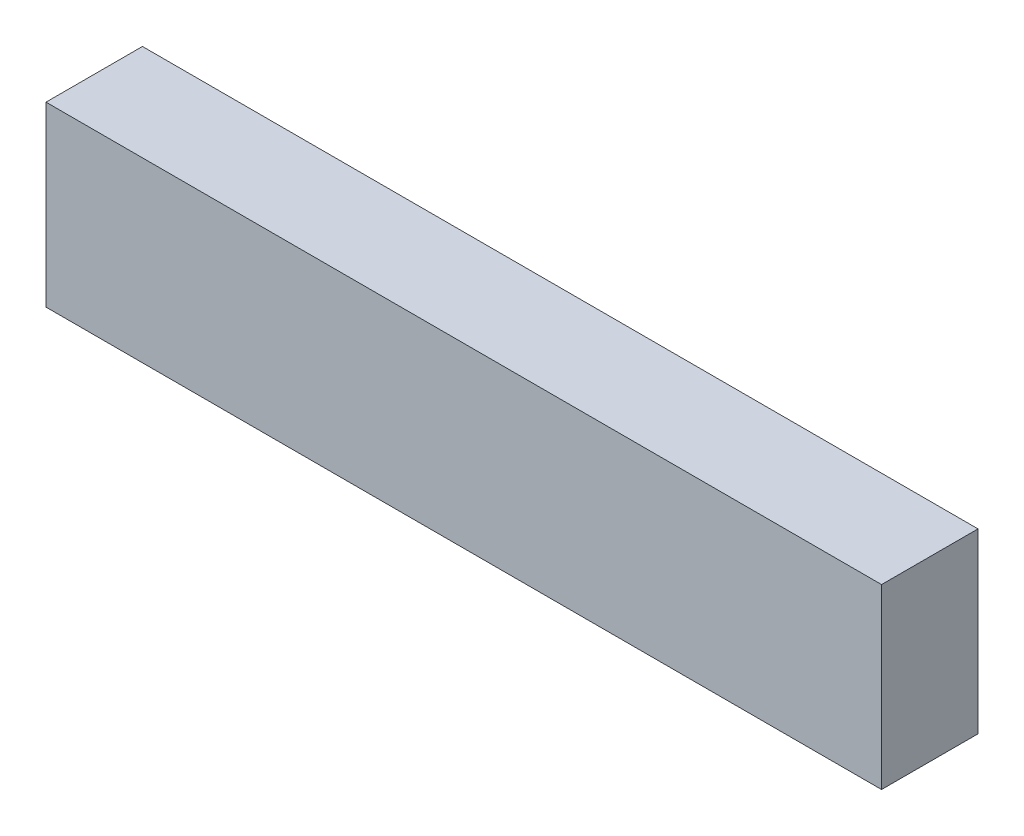
ISO-10303-21;
HEADER;
FILE_DESCRIPTION(('STEP AP214'),'2;1');
FILE_NAME('part.step','',(''),(''),'','','');
FILE_SCHEMA(('AUTOMOTIVE_DESIGN { 1 0 10303 214 1 1 1 1 }'));
ENDSEC;
DATA;
#1=APPLICATION_CONTEXT('core data for automotive mechanical design processes');
#2=APPLICATION_PROTOCOL_DEFINITION('international standard','automotive_design',2000,#1);
#3=PRODUCT_CONTEXT('',#1,'mechanical');
#4=PRODUCT('Part','Part','',(#3));
#5=PRODUCT_RELATED_PRODUCT_CATEGORY('part','',(#4));
#6=PRODUCT_DEFINITION_FORMATION('','',#4);
#7=PRODUCT_DEFINITION_CONTEXT('part definition',#1,'design');
#8=PRODUCT_DEFINITION('design','',#6,#7);
#9=PRODUCT_DEFINITION_SHAPE('','',#8);
#10=(LENGTH_UNIT() NAMED_UNIT(*) SI_UNIT(.MILLI.,.METRE.));
#11=(NAMED_UNIT(*) PLANE_ANGLE_UNIT() SI_UNIT($,.RADIAN.));
#12=(NAMED_UNIT(*) SI_UNIT($,.STERADIAN.) SOLID_ANGLE_UNIT());
#13=UNCERTAINTY_MEASURE_WITH_UNIT(LENGTH_MEASURE(1.E-05),#10,'distance_accuracy_value','');
#14=(GEOMETRIC_REPRESENTATION_CONTEXT(3) GLOBAL_UNCERTAINTY_ASSIGNED_CONTEXT((#13)) GLOBAL_UNIT_ASSIGNED_CONTEXT((#10,
#11,#12)) REPRESENTATION_CONTEXT('',''));
#15=CARTESIAN_POINT('',(0.,0.,0.));
#16=DIRECTION('',(0.,0.,1.));
#17=DIRECTION('',(1.,0.,0.));
#18=AXIS2_PLACEMENT_3D('',#15,#16,#17);
#19=CARTESIAN_POINT('',(62.6,-13.3,14.45));
#20=DIRECTION('',(-1.,0.,0.));
#21=DIRECTION('',(0.,-1.,0.));
#22=AXIS2_PLACEMENT_3D('',#19,#20,#21);
#23=PLANE('',#22);
#24=DIRECTION('',(0.,1.,0.));
#25=VECTOR('',#24,1.);
#26=CARTESIAN_POINT('',(62.6,-13.3,0.));
#27=LINE('',#26,#25);
#28=CARTESIAN_POINT('',(62.6,-13.3,0.));
#29=VERTEX_POINT('',#28);
#30=CARTESIAN_POINT('',(62.6,13.3,0.));
#31=VERTEX_POINT('',#30);
#32=EDGE_CURVE('E102',#29,#31,#27,.T.);
#33=ORIENTED_EDGE('',*,*,#32,.T.);
#34=DIRECTION('',(0.,0.,-1.));
#35=VECTOR('',#34,1.);
#36=CARTESIAN_POINT('',(62.6,13.3,14.45));
#37=LINE('',#36,#35);
#38=CARTESIAN_POINT('',(62.6,13.3,14.45));
#39=VERTEX_POINT('',#38);
#40=EDGE_CURVE('E11',#39,#31,#37,.T.);
#41=ORIENTED_EDGE('',*,*,#40,.F.);
#42=DIRECTION('',(0.,1.,0.));
#43=VECTOR('',#42,1.);
#44=CARTESIAN_POINT('',(62.6,-13.3,14.45));
#45=LINE('',#44,#43);
#46=CARTESIAN_POINT('',(62.6,-13.3,14.45));
#47=VERTEX_POINT('',#46);
#48=EDGE_CURVE('E90',#47,#39,#45,.T.);
#49=ORIENTED_EDGE('',*,*,#48,.F.);
#50=DIRECTION('',(0.,0.,-1.));
#51=VECTOR('',#50,1.);
#52=CARTESIAN_POINT('',(62.6,-13.3,14.45));
#53=LINE('',#52,#51);
#54=EDGE_CURVE('E98',#47,#29,#53,.T.);
#55=ORIENTED_EDGE('',*,*,#54,.T.);
#56=EDGE_LOOP('',(#33,#41,#49,#55));
#57=FACE_BOUND('',#56,.T.);
#58=ADVANCED_FACE('F39',(#57),#23,.F.);
#59=CARTESIAN_POINT('',(-62.6,13.3,14.45));
#60=DIRECTION('',(0.,-1.,0.));
#61=DIRECTION('',(0.,0.,-1.));
#62=AXIS2_PLACEMENT_3D('',#59,#60,#61);
#63=PLANE('',#62);
#64=DIRECTION('',(-1.,0.,0.));
#65=VECTOR('',#64,1.);
#66=CARTESIAN_POINT('',(-62.6,13.3,0.));
#67=LINE('',#66,#65);
#68=CARTESIAN_POINT('',(-62.6,13.3,0.));
#69=VERTEX_POINT('',#68);
#70=EDGE_CURVE('E94',#31,#69,#67,.T.);
#71=ORIENTED_EDGE('',*,*,#70,.T.);
#72=DIRECTION('',(0.,0.,-1.));
#73=VECTOR('',#72,1.);
#74=CARTESIAN_POINT('',(-62.6,13.3,14.45));
#75=LINE('',#74,#73);
#76=CARTESIAN_POINT('',(-62.6,13.3,14.45));
#77=VERTEX_POINT('',#76);
#78=EDGE_CURVE('E47',#77,#69,#75,.T.);
#79=ORIENTED_EDGE('',*,*,#78,.F.);
#80=DIRECTION('',(-1.,0.,0.));
#81=VECTOR('',#80,1.);
#82=CARTESIAN_POINT('',(-62.6,13.3,14.45));
#83=LINE('',#82,#81);
#84=EDGE_CURVE('E85',#39,#77,#83,.T.);
#85=ORIENTED_EDGE('',*,*,#84,.F.);
#86=ORIENTED_EDGE('',*,*,#40,.T.);
#87=EDGE_LOOP('',(#71,#79,#85,#86));
#88=FACE_BOUND('',#87,.T.);
#89=ADVANCED_FACE('F93',(#88),#63,.F.);
#90=CARTESIAN_POINT('',(-62.6,-13.3,14.45));
#91=DIRECTION('',(1.,0.,0.));
#92=DIRECTION('',(0.,0.,-1.));
#93=AXIS2_PLACEMENT_3D('',#90,#91,#92);
#94=PLANE('',#93);
#95=DIRECTION('',(0.,-1.,0.));
#96=VECTOR('',#95,1.);
#97=CARTESIAN_POINT('',(-62.6,-13.3,0.));
#98=LINE('',#97,#96);
#99=CARTESIAN_POINT('',(-62.6,-13.3,0.));
#100=VERTEX_POINT('',#99);
#101=EDGE_CURVE('E72',#69,#100,#98,.T.);
#102=ORIENTED_EDGE('',*,*,#101,.T.);
#103=DIRECTION('',(0.,0.,-1.));
#104=VECTOR('',#103,1.);
#105=CARTESIAN_POINT('',(-62.6,-13.3,14.45));
#106=LINE('',#105,#104);
#107=CARTESIAN_POINT('',(-62.6,-13.3,14.45));
#108=VERTEX_POINT('',#107);
#109=EDGE_CURVE('E95',#108,#100,#106,.T.);
#110=ORIENTED_EDGE('',*,*,#109,.F.);
#111=DIRECTION('',(0.,-1.,0.));
#112=VECTOR('',#111,1.);
#113=CARTESIAN_POINT('',(-62.6,-13.3,14.45));
#114=LINE('',#113,#112);
#115=EDGE_CURVE('E88',#77,#108,#114,.T.);
#116=ORIENTED_EDGE('',*,*,#115,.F.);
#117=ORIENTED_EDGE('',*,*,#78,.T.);
#118=EDGE_LOOP('',(#102,#110,#116,#117));
#119=FACE_BOUND('',#118,.T.);
#120=ADVANCED_FACE('F96',(#119),#94,.F.);
#121=CARTESIAN_POINT('',(-62.6,-13.3,14.45));
#122=DIRECTION('',(0.,1.,0.));
#123=DIRECTION('',(0.,0.,1.));
#124=AXIS2_PLACEMENT_3D('',#121,#122,#123);
#125=PLANE('',#124);
#126=DIRECTION('',(1.,0.,0.));
#127=VECTOR('',#126,1.);
#128=CARTESIAN_POINT('',(-62.6,-13.3,0.));
#129=LINE('',#128,#127);
#130=EDGE_CURVE('E78',#100,#29,#129,.T.);
#131=ORIENTED_EDGE('',*,*,#130,.T.);
#132=ORIENTED_EDGE('',*,*,#54,.F.);
#133=DIRECTION('',(1.,0.,0.));
#134=VECTOR('',#133,1.);
#135=CARTESIAN_POINT('',(-62.6,-13.3,14.45));
#136=LINE('',#135,#134);
#137=EDGE_CURVE('E55',#108,#47,#136,.T.);
#138=ORIENTED_EDGE('',*,*,#137,.F.);
#139=ORIENTED_EDGE('',*,*,#109,.T.);
#140=EDGE_LOOP('',(#131,#132,#138,#139));
#141=FACE_BOUND('',#140,.T.);
#142=ADVANCED_FACE('F109',(#141),#125,.F.);
#143=CARTESIAN_POINT('',(0.,0.,14.45));
#144=DIRECTION('',(0.,0.,-1.));
#145=DIRECTION('',(-1.,0.,0.));
#146=AXIS2_PLACEMENT_3D('',#143,#144,#145);
#147=PLANE('',#146);
#148=ORIENTED_EDGE('',*,*,#48,.T.);
#149=ORIENTED_EDGE('',*,*,#84,.T.);
#150=ORIENTED_EDGE('',*,*,#115,.T.);
#151=ORIENTED_EDGE('',*,*,#137,.T.);
#152=EDGE_LOOP('',(#148,#149,#150,#151));
#153=FACE_BOUND('',#152,.T.);
#154=ADVANCED_FACE('F86',(#153),#147,.F.);
#155=CARTESIAN_POINT('',(0.,0.,0.));
#156=DIRECTION('',(0.,0.,-1.));
#157=DIRECTION('',(-1.,0.,0.));
#158=AXIS2_PLACEMENT_3D('',#155,#156,#157);
#159=PLANE('',#158);
#160=ORIENTED_EDGE('',*,*,#32,.F.);
#161=ORIENTED_EDGE('',*,*,#130,.F.);
#162=ORIENTED_EDGE('',*,*,#101,.F.);
#163=ORIENTED_EDGE('',*,*,#70,.F.);
#164=EDGE_LOOP('',(#160,#161,#162,#163));
#165=FACE_BOUND('',#164,.T.);
#166=ADVANCED_FACE('F112',(#165),#159,.T.);
#167=CLOSED_SHELL('',(#58,#89,#120,#142,#154,#166));
#168=MANIFOLD_SOLID_BREP('B2',#167);
#169=ADVANCED_BREP_SHAPE_REPRESENTATION('',(#18,#168),#14);
#170=SHAPE_DEFINITION_REPRESENTATION(#9,#169);
ENDSEC;
END-ISO-10303-21;
